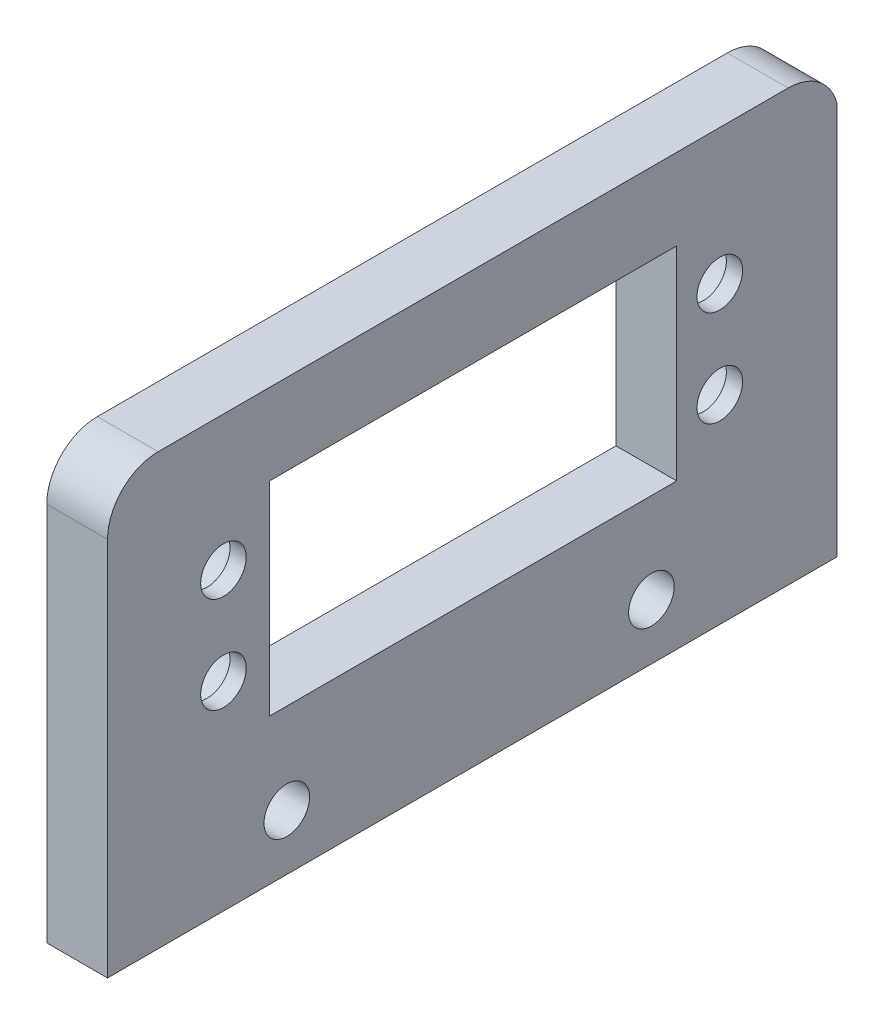
ISO-10303-21;
HEADER;
FILE_DESCRIPTION(('STEP AP214'),'2;1');
FILE_NAME('part.step','',(''),(''),'','','');
FILE_SCHEMA(('AUTOMOTIVE_DESIGN { 1 0 10303 214 1 1 1 1 }'));
ENDSEC;
DATA;
#1=APPLICATION_CONTEXT('core data for automotive mechanical design processes');
#2=APPLICATION_PROTOCOL_DEFINITION('international standard','automotive_design',2000,#1);
#3=PRODUCT_CONTEXT('',#1,'mechanical');
#4=PRODUCT('Part','Part','',(#3));
#5=PRODUCT_RELATED_PRODUCT_CATEGORY('part','',(#4));
#6=PRODUCT_DEFINITION_FORMATION('','',#4);
#7=PRODUCT_DEFINITION_CONTEXT('part definition',#1,'design');
#8=PRODUCT_DEFINITION('design','',#6,#7);
#9=PRODUCT_DEFINITION_SHAPE('','',#8);
#10=(LENGTH_UNIT() NAMED_UNIT(*) SI_UNIT(.MILLI.,.METRE.));
#11=(NAMED_UNIT(*) PLANE_ANGLE_UNIT() SI_UNIT($,.RADIAN.));
#12=(NAMED_UNIT(*) SI_UNIT($,.STERADIAN.) SOLID_ANGLE_UNIT());
#13=UNCERTAINTY_MEASURE_WITH_UNIT(LENGTH_MEASURE(1.E-05),#10,'distance_accuracy_value','');
#14=(GEOMETRIC_REPRESENTATION_CONTEXT(3) GLOBAL_UNCERTAINTY_ASSIGNED_CONTEXT((#13)) GLOBAL_UNIT_ASSIGNED_CONTEXT((#10,
#11,#12)) REPRESENTATION_CONTEXT('',''));
#15=CARTESIAN_POINT('',(0.,0.,0.));
#16=DIRECTION('',(0.,0.,1.));
#17=DIRECTION('',(1.,0.,0.));
#18=AXIS2_PLACEMENT_3D('',#15,#16,#17);
#19=CARTESIAN_POINT('',(6.,17.55,31.0961179679779));
#20=DIRECTION('',(-1.,0.,0.));
#21=DIRECTION('',(0.,0.,1.));
#22=AXIS2_PLACEMENT_3D('',#19,#20,#21);
#23=CYLINDRICAL_SURFACE('',#22,5.);
#24=CARTESIAN_POINT('',(0.,17.55,31.0961179679779));
#25=DIRECTION('',(-1.,0.,0.));
#26=DIRECTION('',(0.,0.,1.));
#27=AXIS2_PLACEMENT_3D('',#24,#25,#26);
#28=CIRCLE('',#27,5.);
#29=CARTESIAN_POINT('',(0.,17.55,36.0961179679779));
#30=VERTEX_POINT('',#29);
#31=CARTESIAN_POINT('',(0.,22.55,31.0961179679779));
#32=VERTEX_POINT('',#31);
#33=EDGE_CURVE('E154',#30,#32,#28,.T.);
#34=ORIENTED_EDGE('',*,*,#33,.F.);
#35=DIRECTION('',(-1.,0.,0.));
#36=VECTOR('',#35,1.);
#37=CARTESIAN_POINT('',(6.,17.55,36.0961179679779));
#38=LINE('',#37,#36);
#39=CARTESIAN_POINT('',(6.,17.55,36.0961179679779));
#40=VERTEX_POINT('',#39);
#41=EDGE_CURVE('E12',#40,#30,#38,.T.);
#42=ORIENTED_EDGE('',*,*,#41,.F.);
#43=CARTESIAN_POINT('',(6.,17.55,31.0961179679779));
#44=DIRECTION('',(-1.,0.,0.));
#45=DIRECTION('',(0.,0.,1.));
#46=AXIS2_PLACEMENT_3D('',#43,#44,#45);
#47=CIRCLE('',#46,5.);
#48=CARTESIAN_POINT('',(6.,22.55,31.0961179679779));
#49=VERTEX_POINT('',#48);
#50=EDGE_CURVE('E186',#40,#49,#47,.T.);
#51=ORIENTED_EDGE('',*,*,#50,.T.);
#52=DIRECTION('',(-1.,0.,0.));
#53=VECTOR('',#52,1.);
#54=CARTESIAN_POINT('',(6.,22.55,31.0961179679779));
#55=LINE('',#54,#53);
#56=EDGE_CURVE('E71',#49,#32,#55,.T.);
#57=ORIENTED_EDGE('',*,*,#56,.T.);
#58=EDGE_LOOP('',(#34,#42,#51,#57));
#59=FACE_BOUND('',#58,.T.);
#60=ADVANCED_FACE('F68',(#59),#23,.T.);
#61=CARTESIAN_POINT('',(6.,-19.95,36.0961179679779));
#62=DIRECTION('',(0.,0.,1.));
#63=DIRECTION('',(0.,-1.,0.));
#64=AXIS2_PLACEMENT_3D('',#61,#62,#63);
#65=PLANE('',#64);
#66=DIRECTION('',(0.,1.,0.));
#67=VECTOR('',#66,1.);
#68=CARTESIAN_POINT('',(0.,-19.95,36.0961179679779));
#69=LINE('',#68,#67);
#70=CARTESIAN_POINT('',(0.,-19.95,36.0961179679779));
#71=VERTEX_POINT('',#70);
#72=EDGE_CURVE('E190',#71,#30,#69,.T.);
#73=ORIENTED_EDGE('',*,*,#72,.F.);
#74=DIRECTION('',(-1.,0.,0.));
#75=VECTOR('',#74,1.);
#76=CARTESIAN_POINT('',(6.,-19.95,36.0961179679779));
#77=LINE('',#76,#75);
#78=CARTESIAN_POINT('',(6.,-19.95,36.0961179679779));
#79=VERTEX_POINT('',#78);
#80=EDGE_CURVE('E76',#79,#71,#77,.T.);
#81=ORIENTED_EDGE('',*,*,#80,.F.);
#82=DIRECTION('',(0.,1.,0.));
#83=VECTOR('',#82,1.);
#84=CARTESIAN_POINT('',(6.,-19.95,36.0961179679779));
#85=LINE('',#84,#83);
#86=EDGE_CURVE('E202',#79,#40,#85,.T.);
#87=ORIENTED_EDGE('',*,*,#86,.T.);
#88=ORIENTED_EDGE('',*,*,#41,.T.);
#89=EDGE_LOOP('',(#73,#81,#87,#88));
#90=FACE_BOUND('',#89,.T.);
#91=ADVANCED_FACE('F241',(#90),#65,.T.);
#92=CARTESIAN_POINT('',(6.,-19.95,-35.9468304687046));
#93=DIRECTION('',(0.,-1.,0.));
#94=DIRECTION('',(0.,0.,-1.));
#95=AXIS2_PLACEMENT_3D('',#92,#93,#94);
#96=PLANE('',#95);
#97=DIRECTION('',(0.,0.,1.));
#98=VECTOR('',#97,1.);
#99=CARTESIAN_POINT('',(0.,-19.95,-35.9468304687046));
#100=LINE('',#99,#98);
#101=CARTESIAN_POINT('',(0.,-19.95,-35.9468304687046));
#102=VERTEX_POINT('',#101);
#103=EDGE_CURVE('E216',#102,#71,#100,.T.);
#104=ORIENTED_EDGE('',*,*,#103,.F.);
#105=DIRECTION('',(-1.,0.,0.));
#106=VECTOR('',#105,1.);
#107=CARTESIAN_POINT('',(6.,-19.95,-35.9468304687046));
#108=LINE('',#107,#106);
#109=CARTESIAN_POINT('',(6.,-19.95,-35.9468304687046));
#110=VERTEX_POINT('',#109);
#111=EDGE_CURVE('E222',#110,#102,#108,.T.);
#112=ORIENTED_EDGE('',*,*,#111,.F.);
#113=DIRECTION('',(0.,0.,1.));
#114=VECTOR('',#113,1.);
#115=CARTESIAN_POINT('',(6.,-19.95,-35.9468304687046));
#116=LINE('',#115,#114);
#117=EDGE_CURVE('E199',#110,#79,#116,.T.);
#118=ORIENTED_EDGE('',*,*,#117,.T.);
#119=ORIENTED_EDGE('',*,*,#80,.T.);
#120=EDGE_LOOP('',(#104,#112,#118,#119));
#121=FACE_BOUND('',#120,.T.);
#122=ADVANCED_FACE('F252',(#121),#96,.T.);
#123=CARTESIAN_POINT('',(6.,18.7626781251816,-35.9468304687046));
#124=DIRECTION('',(0.,0.,-1.));
#125=DIRECTION('',(-1.,0.,0.));
#126=AXIS2_PLACEMENT_3D('',#123,#124,#125);
#127=PLANE('',#126);
#128=DIRECTION('',(0.,-1.,0.));
#129=VECTOR('',#128,1.);
#130=CARTESIAN_POINT('',(0.,18.7626781251816,-35.9468304687046));
#131=LINE('',#130,#129);
#132=CARTESIAN_POINT('',(0.,18.7626781251816,-35.9468304687046));
#133=VERTEX_POINT('',#132);
#134=EDGE_CURVE('E213',#133,#102,#131,.T.);
#135=ORIENTED_EDGE('',*,*,#134,.F.);
#136=DIRECTION('',(-1.,0.,0.));
#137=VECTOR('',#136,1.);
#138=CARTESIAN_POINT('',(6.,18.7626781251816,-35.9468304687046));
#139=LINE('',#138,#137);
#140=CARTESIAN_POINT('',(6.,18.7626781251816,-35.9468304687046));
#141=VERTEX_POINT('',#140);
#142=EDGE_CURVE('E224',#141,#133,#139,.T.);
#143=ORIENTED_EDGE('',*,*,#142,.F.);
#144=DIRECTION('',(0.,-1.,0.));
#145=VECTOR('',#144,1.);
#146=CARTESIAN_POINT('',(6.,18.7626781251816,-35.9468304687046));
#147=LINE('',#146,#145);
#148=EDGE_CURVE('E196',#141,#110,#147,.T.);
#149=ORIENTED_EDGE('',*,*,#148,.T.);
#150=ORIENTED_EDGE('',*,*,#111,.T.);
#151=EDGE_LOOP('',(#135,#143,#149,#150));
#152=FACE_BOUND('',#151,.T.);
#153=ADVANCED_FACE('F250',(#152),#127,.T.);
#154=CARTESIAN_POINT('',(6.,17.55,-31.0961179679779));
#155=DIRECTION('',(-1.,0.,0.));
#156=DIRECTION('',(0.,0.,1.));
#157=AXIS2_PLACEMENT_3D('',#154,#155,#156);
#158=CYLINDRICAL_SURFACE('',#157,5.);
#159=CARTESIAN_POINT('',(0.,17.55,-31.0961179679779));
#160=DIRECTION('',(-1.,0.,0.));
#161=DIRECTION('',(0.,0.,1.));
#162=AXIS2_PLACEMENT_3D('',#159,#160,#161);
#163=CIRCLE('',#162,5.);
#164=CARTESIAN_POINT('',(0.,22.55,-31.0961179679779));
#165=VERTEX_POINT('',#164);
#166=EDGE_CURVE('E210',#165,#133,#163,.T.);
#167=ORIENTED_EDGE('',*,*,#166,.F.);
#168=DIRECTION('',(-1.,0.,0.));
#169=VECTOR('',#168,1.);
#170=CARTESIAN_POINT('',(6.,22.55,-31.0961179679779));
#171=LINE('',#170,#169);
#172=CARTESIAN_POINT('',(6.,22.55,-31.0961179679779));
#173=VERTEX_POINT('',#172);
#174=EDGE_CURVE('E225',#173,#165,#171,.T.);
#175=ORIENTED_EDGE('',*,*,#174,.F.);
#176=CARTESIAN_POINT('',(6.,17.55,-31.0961179679779));
#177=DIRECTION('',(-1.,0.,0.));
#178=DIRECTION('',(0.,0.,1.));
#179=AXIS2_PLACEMENT_3D('',#176,#177,#178);
#180=CIRCLE('',#179,5.);
#181=EDGE_CURVE('E193',#173,#141,#180,.T.);
#182=ORIENTED_EDGE('',*,*,#181,.T.);
#183=ORIENTED_EDGE('',*,*,#142,.T.);
#184=EDGE_LOOP('',(#167,#175,#182,#183));
#185=FACE_BOUND('',#184,.T.);
#186=ADVANCED_FACE('F247',(#185),#158,.T.);
#187=CARTESIAN_POINT('',(6.,22.55,31.0961179679779));
#188=DIRECTION('',(0.,1.,0.));
#189=DIRECTION('',(0.,0.,1.));
#190=AXIS2_PLACEMENT_3D('',#187,#188,#189);
#191=PLANE('',#190);
#192=DIRECTION('',(0.,0.,-1.));
#193=VECTOR('',#192,1.);
#194=CARTESIAN_POINT('',(0.,22.55,31.0961179679779));
#195=LINE('',#194,#193);
#196=EDGE_CURVE('E207',#32,#165,#195,.T.);
#197=ORIENTED_EDGE('',*,*,#196,.F.);
#198=ORIENTED_EDGE('',*,*,#56,.F.);
#199=DIRECTION('',(0.,0.,-1.));
#200=VECTOR('',#199,1.);
#201=CARTESIAN_POINT('',(6.,22.55,31.0961179679779));
#202=LINE('',#201,#200);
#203=EDGE_CURVE('E189',#49,#173,#202,.T.);
#204=ORIENTED_EDGE('',*,*,#203,.T.);
#205=ORIENTED_EDGE('',*,*,#174,.T.);
#206=EDGE_LOOP('',(#197,#198,#204,#205));
#207=FACE_BOUND('',#206,.T.);
#208=ADVANCED_FACE('F235',(#207),#191,.T.);
#209=CARTESIAN_POINT('',(6.,17.55,31.0961179679779));
#210=DIRECTION('',(-1.,0.,0.));
#211=DIRECTION('',(0.,0.,1.));
#212=AXIS2_PLACEMENT_3D('',#209,#210,#211);
#213=PLANE('',#212);
#214=CARTESIAN_POINT('',(6.00000000000001,-14.45,-17.6000000000001));
#215=DIRECTION('',(-1.,0.,0.));
#216=DIRECTION('',(0.,0.,1.));
#217=AXIS2_PLACEMENT_3D('',#214,#215,#216);
#218=CIRCLE('',#217,2.24999999999999);
#219=CARTESIAN_POINT('',(6.00000000000001,-14.45,-15.3500000000001));
#220=VERTEX_POINT('',#219);
#221=EDGE_CURVE('E493',#220,#220,#218,.T.);
#222=ORIENTED_EDGE('',*,*,#221,.T.);
#223=EDGE_LOOP('',(#222));
#224=FACE_BOUND('',#223,.T.);
#225=CARTESIAN_POINT('',(6.00000000000001,-14.45,18.3999999999999));
#226=DIRECTION('',(-1.,0.,0.));
#227=DIRECTION('',(0.,0.,1.));
#228=AXIS2_PLACEMENT_3D('',#225,#226,#227);
#229=CIRCLE('',#228,2.24999999999999);
#230=CARTESIAN_POINT('',(6.00000000000001,-14.45,20.6499999999999));
#231=VERTEX_POINT('',#230);
#232=EDGE_CURVE('E503',#231,#231,#229,.T.);
#233=ORIENTED_EDGE('',*,*,#232,.T.);
#234=EDGE_LOOP('',(#233));
#235=FACE_BOUND('',#234,.T.);
#236=CARTESIAN_POINT('',(6.00000000000001,-0.299999999999995,24.65));
#237=DIRECTION('',(-1.,0.,0.));
#238=DIRECTION('',(0.,0.,1.));
#239=AXIS2_PLACEMENT_3D('',#236,#237,#238);
#240=CIRCLE('',#239,2.25000000000001);
#241=CARTESIAN_POINT('',(6.00000000000001,-0.299999999999995,26.9));
#242=VERTEX_POINT('',#241);
#243=EDGE_CURVE('E515',#242,#242,#240,.T.);
#244=ORIENTED_EDGE('',*,*,#243,.T.);
#245=EDGE_LOOP('',(#244));
#246=FACE_BOUND('',#245,.T.);
#247=CARTESIAN_POINT('',(6.00000000000001,9.20000000000001,24.65));
#248=DIRECTION('',(-1.,0.,0.));
#249=DIRECTION('',(0.,0.,1.));
#250=AXIS2_PLACEMENT_3D('',#247,#248,#249);
#251=CIRCLE('',#250,2.25000000000001);
#252=CARTESIAN_POINT('',(6.00000000000001,9.20000000000001,26.9));
#253=VERTEX_POINT('',#252);
#254=EDGE_CURVE('E527',#253,#253,#251,.T.);
#255=ORIENTED_EDGE('',*,*,#254,.T.);
#256=EDGE_LOOP('',(#255));
#257=FACE_BOUND('',#256,.T.);
#258=CARTESIAN_POINT('',(6.00000000000001,-0.299999999999995,-24.3500000000001));
#259=DIRECTION('',(-1.,0.,0.));
#260=DIRECTION('',(0.,0.,1.));
#261=AXIS2_PLACEMENT_3D('',#258,#259,#260);
#262=CIRCLE('',#261,2.25000000000001);
#263=CARTESIAN_POINT('',(6.00000000000001,-0.299999999999995,-22.1000000000001));
#264=VERTEX_POINT('',#263);
#265=EDGE_CURVE('E539',#264,#264,#262,.T.);
#266=ORIENTED_EDGE('',*,*,#265,.T.);
#267=EDGE_LOOP('',(#266));
#268=FACE_BOUND('',#267,.T.);
#269=CARTESIAN_POINT('',(6.00000000000001,9.20000000000001,-24.3500000000001));
#270=DIRECTION('',(-1.,0.,0.));
#271=DIRECTION('',(0.,0.,1.));
#272=AXIS2_PLACEMENT_3D('',#269,#270,#271);
#273=CIRCLE('',#272,2.25000000000001);
#274=CARTESIAN_POINT('',(6.00000000000001,9.20000000000001,-22.1000000000001));
#275=VERTEX_POINT('',#274);
#276=EDGE_CURVE('E176',#275,#275,#273,.T.);
#277=ORIENTED_EDGE('',*,*,#276,.T.);
#278=EDGE_LOOP('',(#277));
#279=FACE_BOUND('',#278,.T.);
#280=DIRECTION('',(0.,0.,1.));
#281=VECTOR('',#280,1.);
#282=CARTESIAN_POINT('',(6.,-5.55,0.));
#283=LINE('',#282,#281);
#284=CARTESIAN_POINT('',(6.,-5.55,-20.1));
#285=VERTEX_POINT('',#284);
#286=CARTESIAN_POINT('',(6.,-5.55,20.1));
#287=VERTEX_POINT('',#286);
#288=EDGE_CURVE('E150',#285,#287,#283,.T.);
#289=ORIENTED_EDGE('',*,*,#288,.T.);
#290=DIRECTION('',(0.,1.,0.));
#291=VECTOR('',#290,1.);
#292=CARTESIAN_POINT('',(6.,0.,20.1));
#293=LINE('',#292,#291);
#294=CARTESIAN_POINT('',(6.,14.55,20.1));
#295=VERTEX_POINT('',#294);
#296=EDGE_CURVE('E158',#287,#295,#293,.T.);
#297=ORIENTED_EDGE('',*,*,#296,.T.);
#298=DIRECTION('',(0.,0.,1.));
#299=VECTOR('',#298,1.);
#300=CARTESIAN_POINT('',(6.,14.55,0.));
#301=LINE('',#300,#299);
#302=CARTESIAN_POINT('',(6.,14.55,-20.1));
#303=VERTEX_POINT('',#302);
#304=EDGE_CURVE('E169',#303,#295,#301,.T.);
#305=ORIENTED_EDGE('',*,*,#304,.F.);
#306=DIRECTION('',(0.,1.,0.));
#307=VECTOR('',#306,1.);
#308=CARTESIAN_POINT('',(6.,0.,-20.1));
#309=LINE('',#308,#307);
#310=EDGE_CURVE('E167',#285,#303,#309,.T.);
#311=ORIENTED_EDGE('',*,*,#310,.F.);
#312=EDGE_LOOP('',(#289,#297,#305,#311));
#313=FACE_BOUND('',#312,.T.);
#314=ORIENTED_EDGE('',*,*,#50,.F.);
#315=ORIENTED_EDGE('',*,*,#86,.F.);
#316=ORIENTED_EDGE('',*,*,#117,.F.);
#317=ORIENTED_EDGE('',*,*,#148,.F.);
#318=ORIENTED_EDGE('',*,*,#181,.F.);
#319=ORIENTED_EDGE('',*,*,#203,.F.);
#320=EDGE_LOOP('',(#314,#315,#316,#317,#318,#319));
#321=FACE_BOUND('',#320,.T.);
#322=ADVANCED_FACE('F165',(#224,#235,#246,#257,#268,#279,#313,#321),#213,.F.);
#323=CARTESIAN_POINT('',(0.,17.55,31.0961179679779));
#324=DIRECTION('',(-1.,0.,0.));
#325=DIRECTION('',(0.,0.,1.));
#326=AXIS2_PLACEMENT_3D('',#323,#324,#325);
#327=PLANE('',#326);
#328=CARTESIAN_POINT('',(0.,-14.45,-17.6000000000001));
#329=DIRECTION('',(-1.,0.,0.));
#330=DIRECTION('',(0.,0.,1.));
#331=AXIS2_PLACEMENT_3D('',#328,#329,#330);
#332=CIRCLE('',#331,2.24999999999999);
#333=CARTESIAN_POINT('',(0.,-14.45,-15.3500000000001));
#334=VERTEX_POINT('',#333);
#335=EDGE_CURVE('E496',#334,#334,#332,.T.);
#336=ORIENTED_EDGE('',*,*,#335,.F.);
#337=EDGE_LOOP('',(#336));
#338=FACE_BOUND('',#337,.T.);
#339=CARTESIAN_POINT('',(0.,-14.45,18.3999999999999));
#340=DIRECTION('',(-1.,0.,0.));
#341=DIRECTION('',(0.,0.,1.));
#342=AXIS2_PLACEMENT_3D('',#339,#340,#341);
#343=CIRCLE('',#342,2.24999999999999);
#344=CARTESIAN_POINT('',(0.,-14.45,20.6499999999999));
#345=VERTEX_POINT('',#344);
#346=EDGE_CURVE('E498',#345,#345,#343,.T.);
#347=ORIENTED_EDGE('',*,*,#346,.F.);
#348=EDGE_LOOP('',(#347));
#349=FACE_BOUND('',#348,.T.);
#350=CARTESIAN_POINT('',(0.,-0.299999999999995,24.65));
#351=DIRECTION('',(-1.,0.,0.));
#352=DIRECTION('',(0.,0.,1.));
#353=AXIS2_PLACEMENT_3D('',#350,#351,#352);
#354=CIRCLE('',#353,3.99999999999999);
#355=CARTESIAN_POINT('',(0.,-0.299999999999995,28.65));
#356=VERTEX_POINT('',#355);
#357=EDGE_CURVE('E506',#356,#356,#354,.T.);
#358=ORIENTED_EDGE('',*,*,#357,.F.);
#359=EDGE_LOOP('',(#358));
#360=FACE_BOUND('',#359,.T.);
#361=CARTESIAN_POINT('',(0.,9.20000000000001,24.65));
#362=DIRECTION('',(-1.,0.,0.));
#363=DIRECTION('',(0.,0.,1.));
#364=AXIS2_PLACEMENT_3D('',#361,#362,#363);
#365=CIRCLE('',#364,3.99999999999999);
#366=CARTESIAN_POINT('',(0.,9.20000000000001,28.65));
#367=VERTEX_POINT('',#366);
#368=EDGE_CURVE('E518',#367,#367,#365,.T.);
#369=ORIENTED_EDGE('',*,*,#368,.F.);
#370=EDGE_LOOP('',(#369));
#371=FACE_BOUND('',#370,.T.);
#372=CARTESIAN_POINT('',(0.,-0.299999999999995,-24.3500000000001));
#373=DIRECTION('',(-1.,0.,0.));
#374=DIRECTION('',(0.,0.,1.));
#375=AXIS2_PLACEMENT_3D('',#372,#373,#374);
#376=CIRCLE('',#375,3.99999999999999);
#377=CARTESIAN_POINT('',(0.,-0.299999999999995,-20.3500000000001));
#378=VERTEX_POINT('',#377);
#379=EDGE_CURVE('E530',#378,#378,#376,.T.);
#380=ORIENTED_EDGE('',*,*,#379,.F.);
#381=EDGE_LOOP('',(#380));
#382=FACE_BOUND('',#381,.T.);
#383=CARTESIAN_POINT('',(0.,9.20000000000001,-24.3500000000001));
#384=DIRECTION('',(-1.,0.,0.));
#385=DIRECTION('',(0.,0.,1.));
#386=AXIS2_PLACEMENT_3D('',#383,#384,#385);
#387=CIRCLE('',#386,3.99999999999999);
#388=CARTESIAN_POINT('',(0.,9.20000000000001,-20.3500000000001));
#389=VERTEX_POINT('',#388);
#390=EDGE_CURVE('E542',#389,#389,#387,.T.);
#391=ORIENTED_EDGE('',*,*,#390,.F.);
#392=EDGE_LOOP('',(#391));
#393=FACE_BOUND('',#392,.T.);
#394=DIRECTION('',(0.,1.,0.));
#395=VECTOR('',#394,1.);
#396=CARTESIAN_POINT('',(0.,0.,20.1));
#397=LINE('',#396,#395);
#398=CARTESIAN_POINT('',(0.,-5.55,20.1));
#399=VERTEX_POINT('',#398);
#400=CARTESIAN_POINT('',(0.,14.55,20.1));
#401=VERTEX_POINT('',#400);
#402=EDGE_CURVE('E92',#399,#401,#397,.T.);
#403=ORIENTED_EDGE('',*,*,#402,.F.);
#404=DIRECTION('',(0.,0.,1.));
#405=VECTOR('',#404,1.);
#406=CARTESIAN_POINT('',(0.,-5.55,0.));
#407=LINE('',#406,#405);
#408=CARTESIAN_POINT('',(0.,-5.55,-20.1));
#409=VERTEX_POINT('',#408);
#410=EDGE_CURVE('E153',#409,#399,#407,.T.);
#411=ORIENTED_EDGE('',*,*,#410,.F.);
#412=DIRECTION('',(0.,1.,0.));
#413=VECTOR('',#412,1.);
#414=CARTESIAN_POINT('',(0.,0.,-20.1));
#415=LINE('',#414,#413);
#416=CARTESIAN_POINT('',(0.,14.55,-20.1));
#417=VERTEX_POINT('',#416);
#418=EDGE_CURVE('E178',#409,#417,#415,.T.);
#419=ORIENTED_EDGE('',*,*,#418,.T.);
#420=DIRECTION('',(0.,0.,1.));
#421=VECTOR('',#420,1.);
#422=CARTESIAN_POINT('',(0.,14.55,0.));
#423=LINE('',#422,#421);
#424=EDGE_CURVE('E163',#417,#401,#423,.T.);
#425=ORIENTED_EDGE('',*,*,#424,.T.);
#426=EDGE_LOOP('',(#403,#411,#419,#425));
#427=FACE_BOUND('',#426,.T.);
#428=ORIENTED_EDGE('',*,*,#33,.T.);
#429=ORIENTED_EDGE('',*,*,#196,.T.);
#430=ORIENTED_EDGE('',*,*,#166,.T.);
#431=ORIENTED_EDGE('',*,*,#134,.T.);
#432=ORIENTED_EDGE('',*,*,#103,.T.);
#433=ORIENTED_EDGE('',*,*,#72,.T.);
#434=EDGE_LOOP('',(#428,#429,#430,#431,#432,#433));
#435=FACE_BOUND('',#434,.T.);
#436=ADVANCED_FACE('F237',(#338,#349,#360,#371,#382,#393,#427,#435),#327,.T.);
#437=CARTESIAN_POINT('',(6.,0.,20.1));
#438=DIRECTION('',(0.,0.,1.));
#439=DIRECTION('',(1.,0.,0.));
#440=AXIS2_PLACEMENT_3D('',#437,#438,#439);
#441=PLANE('',#440);
#442=ORIENTED_EDGE('',*,*,#402,.T.);
#443=DIRECTION('',(-1.,0.,0.));
#444=VECTOR('',#443,1.);
#445=CARTESIAN_POINT('',(6.,14.55,20.1));
#446=LINE('',#445,#444);
#447=EDGE_CURVE('E160',#295,#401,#446,.T.);
#448=ORIENTED_EDGE('',*,*,#447,.F.);
#449=ORIENTED_EDGE('',*,*,#296,.F.);
#450=DIRECTION('',(-1.,0.,0.));
#451=VECTOR('',#450,1.);
#452=CARTESIAN_POINT('',(6.,-5.55,20.1));
#453=LINE('',#452,#451);
#454=EDGE_CURVE('E146',#287,#399,#453,.T.);
#455=ORIENTED_EDGE('',*,*,#454,.T.);
#456=EDGE_LOOP('',(#442,#448,#449,#455));
#457=FACE_BOUND('',#456,.T.);
#458=ADVANCED_FACE('F159',(#457),#441,.F.);
#459=CARTESIAN_POINT('',(6.,-5.55,0.));
#460=DIRECTION('',(0.,-1.,0.));
#461=DIRECTION('',(0.,0.,-1.));
#462=AXIS2_PLACEMENT_3D('',#459,#460,#461);
#463=PLANE('',#462);
#464=ORIENTED_EDGE('',*,*,#410,.T.);
#465=ORIENTED_EDGE('',*,*,#454,.F.);
#466=ORIENTED_EDGE('',*,*,#288,.F.);
#467=DIRECTION('',(-1.,0.,0.));
#468=VECTOR('',#467,1.);
#469=CARTESIAN_POINT('',(6.,-5.55,-20.1));
#470=LINE('',#469,#468);
#471=EDGE_CURVE('E155',#285,#409,#470,.T.);
#472=ORIENTED_EDGE('',*,*,#471,.T.);
#473=EDGE_LOOP('',(#464,#465,#466,#472));
#474=FACE_BOUND('',#473,.T.);
#475=ADVANCED_FACE('F148',(#474),#463,.F.);
#476=CARTESIAN_POINT('',(6.,0.,-20.1));
#477=DIRECTION('',(0.,0.,1.));
#478=DIRECTION('',(0.,-1.,0.));
#479=AXIS2_PLACEMENT_3D('',#476,#477,#478);
#480=PLANE('',#479);
#481=ORIENTED_EDGE('',*,*,#418,.F.);
#482=ORIENTED_EDGE('',*,*,#471,.F.);
#483=ORIENTED_EDGE('',*,*,#310,.T.);
#484=DIRECTION('',(-1.,0.,0.));
#485=VECTOR('',#484,1.);
#486=CARTESIAN_POINT('',(6.,14.55,-20.1));
#487=LINE('',#486,#485);
#488=EDGE_CURVE('E84',#303,#417,#487,.T.);
#489=ORIENTED_EDGE('',*,*,#488,.T.);
#490=EDGE_LOOP('',(#481,#482,#483,#489));
#491=FACE_BOUND('',#490,.T.);
#492=ADVANCED_FACE('F314',(#491),#480,.T.);
#493=CARTESIAN_POINT('',(6.,14.55,0.));
#494=DIRECTION('',(0.,-1.,0.));
#495=DIRECTION('',(0.,0.,-1.));
#496=AXIS2_PLACEMENT_3D('',#493,#494,#495);
#497=PLANE('',#496);
#498=ORIENTED_EDGE('',*,*,#424,.F.);
#499=ORIENTED_EDGE('',*,*,#488,.F.);
#500=ORIENTED_EDGE('',*,*,#304,.T.);
#501=ORIENTED_EDGE('',*,*,#447,.T.);
#502=EDGE_LOOP('',(#498,#499,#500,#501));
#503=FACE_BOUND('',#502,.T.);
#504=ADVANCED_FACE('F323',(#503),#497,.T.);
#505=CARTESIAN_POINT('',(0.,9.20000000000001,-24.3500000000001));
#506=DIRECTION('',(-1.,0.,0.));
#507=DIRECTION('',(0.,0.,1.));
#508=AXIS2_PLACEMENT_3D('',#505,#506,#507);
#509=CYLINDRICAL_SURFACE('',#508,2.25000000000001);
#510=ORIENTED_EDGE('',*,*,#276,.F.);
#511=EDGE_LOOP('',(#510));
#512=FACE_BOUND('',#511,.T.);
#513=CARTESIAN_POINT('',(4.4,9.20000000000001,-24.3500000000001));
#514=DIRECTION('',(-1.,0.,0.));
#515=DIRECTION('',(0.,0.,1.));
#516=AXIS2_PLACEMENT_3D('',#513,#514,#515);
#517=CIRCLE('',#516,2.25000000000001);
#518=CARTESIAN_POINT('',(4.4,9.20000000000001,-22.1000000000001));
#519=VERTEX_POINT('',#518);
#520=EDGE_CURVE('E548',#519,#519,#517,.T.);
#521=ORIENTED_EDGE('',*,*,#520,.T.);
#522=EDGE_LOOP('',(#521));
#523=FACE_BOUND('',#522,.T.);
#524=ADVANCED_FACE('F333',(#512,#523),#509,.F.);
#525=CARTESIAN_POINT('',(4.4,11.45,-24.3500000000001));
#526=DIRECTION('',(1.,0.,0.));
#527=DIRECTION('',(0.,0.,-1.));
#528=AXIS2_PLACEMENT_3D('',#525,#526,#527);
#529=PLANE('',#528);
#530=ORIENTED_EDGE('',*,*,#520,.F.);
#531=EDGE_LOOP('',(#530));
#532=FACE_BOUND('',#531,.T.);
#533=CARTESIAN_POINT('',(4.4,9.20000000000001,-24.3500000000001));
#534=DIRECTION('',(-1.,0.,0.));
#535=DIRECTION('',(0.,0.,1.));
#536=AXIS2_PLACEMENT_3D('',#533,#534,#535);
#537=CIRCLE('',#536,4.);
#538=CARTESIAN_POINT('',(4.4,9.20000000000001,-20.3500000000001));
#539=VERTEX_POINT('',#538);
#540=EDGE_CURVE('E545',#539,#539,#537,.T.);
#541=ORIENTED_EDGE('',*,*,#540,.T.);
#542=EDGE_LOOP('',(#541));
#543=FACE_BOUND('',#542,.T.);
#544=ADVANCED_FACE('F342',(#532,#543),#529,.F.);
#545=CARTESIAN_POINT('',(0.,9.20000000000001,-24.3500000000001));
#546=DIRECTION('',(-1.,0.,0.));
#547=DIRECTION('',(0.,0.,1.));
#548=AXIS2_PLACEMENT_3D('',#545,#546,#547);
#549=CYLINDRICAL_SURFACE('',#548,3.99999999999999);
#550=ORIENTED_EDGE('',*,*,#540,.F.);
#551=EDGE_LOOP('',(#550));
#552=FACE_BOUND('',#551,.T.);
#553=ORIENTED_EDGE('',*,*,#390,.T.);
#554=EDGE_LOOP('',(#553));
#555=FACE_BOUND('',#554,.T.);
#556=ADVANCED_FACE('F352',(#552,#555),#549,.F.);
#557=CARTESIAN_POINT('',(0.,-0.299999999999995,-24.3500000000001));
#558=DIRECTION('',(-1.,0.,0.));
#559=DIRECTION('',(0.,0.,1.));
#560=AXIS2_PLACEMENT_3D('',#557,#558,#559);
#561=CYLINDRICAL_SURFACE('',#560,2.25000000000001);
#562=ORIENTED_EDGE('',*,*,#265,.F.);
#563=EDGE_LOOP('',(#562));
#564=FACE_BOUND('',#563,.T.);
#565=CARTESIAN_POINT('',(4.4,-0.299999999999995,-24.3500000000001));
#566=DIRECTION('',(-1.,0.,0.));
#567=DIRECTION('',(0.,0.,1.));
#568=AXIS2_PLACEMENT_3D('',#565,#566,#567);
#569=CIRCLE('',#568,2.25000000000001);
#570=CARTESIAN_POINT('',(4.4,-0.299999999999995,-22.1000000000001));
#571=VERTEX_POINT('',#570);
#572=EDGE_CURVE('E536',#571,#571,#569,.T.);
#573=ORIENTED_EDGE('',*,*,#572,.T.);
#574=EDGE_LOOP('',(#573));
#575=FACE_BOUND('',#574,.T.);
#576=ADVANCED_FACE('F362',(#564,#575),#561,.F.);
#577=CARTESIAN_POINT('',(4.4,1.95000000000002,-24.3500000000001));
#578=DIRECTION('',(1.,0.,0.));
#579=DIRECTION('',(0.,0.,-1.));
#580=AXIS2_PLACEMENT_3D('',#577,#578,#579);
#581=PLANE('',#580);
#582=ORIENTED_EDGE('',*,*,#572,.F.);
#583=EDGE_LOOP('',(#582));
#584=FACE_BOUND('',#583,.T.);
#585=CARTESIAN_POINT('',(4.4,-0.299999999999995,-24.3500000000001));
#586=DIRECTION('',(-1.,0.,0.));
#587=DIRECTION('',(0.,0.,1.));
#588=AXIS2_PLACEMENT_3D('',#585,#586,#587);
#589=CIRCLE('',#588,4.);
#590=CARTESIAN_POINT('',(4.4,-0.299999999999995,-20.3500000000001));
#591=VERTEX_POINT('',#590);
#592=EDGE_CURVE('E533',#591,#591,#589,.T.);
#593=ORIENTED_EDGE('',*,*,#592,.T.);
#594=EDGE_LOOP('',(#593));
#595=FACE_BOUND('',#594,.T.);
#596=ADVANCED_FACE('F372',(#584,#595),#581,.F.);
#597=CARTESIAN_POINT('',(0.,-0.299999999999995,-24.3500000000001));
#598=DIRECTION('',(-1.,0.,0.));
#599=DIRECTION('',(0.,0.,1.));
#600=AXIS2_PLACEMENT_3D('',#597,#598,#599);
#601=CYLINDRICAL_SURFACE('',#600,3.99999999999999);
#602=ORIENTED_EDGE('',*,*,#592,.F.);
#603=EDGE_LOOP('',(#602));
#604=FACE_BOUND('',#603,.T.);
#605=ORIENTED_EDGE('',*,*,#379,.T.);
#606=EDGE_LOOP('',(#605));
#607=FACE_BOUND('',#606,.T.);
#608=ADVANCED_FACE('F382',(#604,#607),#601,.F.);
#609=CARTESIAN_POINT('',(0.,9.20000000000001,24.65));
#610=DIRECTION('',(-1.,0.,0.));
#611=DIRECTION('',(0.,0.,1.));
#612=AXIS2_PLACEMENT_3D('',#609,#610,#611);
#613=CYLINDRICAL_SURFACE('',#612,2.25000000000001);
#614=ORIENTED_EDGE('',*,*,#254,.F.);
#615=EDGE_LOOP('',(#614));
#616=FACE_BOUND('',#615,.T.);
#617=CARTESIAN_POINT('',(4.4,9.20000000000001,24.65));
#618=DIRECTION('',(-1.,0.,0.));
#619=DIRECTION('',(0.,0.,1.));
#620=AXIS2_PLACEMENT_3D('',#617,#618,#619);
#621=CIRCLE('',#620,2.25000000000001);
#622=CARTESIAN_POINT('',(4.4,9.20000000000001,26.9));
#623=VERTEX_POINT('',#622);
#624=EDGE_CURVE('E524',#623,#623,#621,.T.);
#625=ORIENTED_EDGE('',*,*,#624,.T.);
#626=EDGE_LOOP('',(#625));
#627=FACE_BOUND('',#626,.T.);
#628=ADVANCED_FACE('F392',(#616,#627),#613,.F.);
#629=CARTESIAN_POINT('',(4.4,11.45,24.65));
#630=DIRECTION('',(1.,0.,0.));
#631=DIRECTION('',(0.,0.,-1.));
#632=AXIS2_PLACEMENT_3D('',#629,#630,#631);
#633=PLANE('',#632);
#634=ORIENTED_EDGE('',*,*,#624,.F.);
#635=EDGE_LOOP('',(#634));
#636=FACE_BOUND('',#635,.T.);
#637=CARTESIAN_POINT('',(4.4,9.20000000000001,24.65));
#638=DIRECTION('',(-1.,0.,0.));
#639=DIRECTION('',(0.,0.,1.));
#640=AXIS2_PLACEMENT_3D('',#637,#638,#639);
#641=CIRCLE('',#640,4.);
#642=CARTESIAN_POINT('',(4.4,9.20000000000001,28.65));
#643=VERTEX_POINT('',#642);
#644=EDGE_CURVE('E521',#643,#643,#641,.T.);
#645=ORIENTED_EDGE('',*,*,#644,.T.);
#646=EDGE_LOOP('',(#645));
#647=FACE_BOUND('',#646,.T.);
#648=ADVANCED_FACE('F402',(#636,#647),#633,.F.);
#649=CARTESIAN_POINT('',(0.,9.20000000000001,24.65));
#650=DIRECTION('',(-1.,0.,0.));
#651=DIRECTION('',(0.,0.,1.));
#652=AXIS2_PLACEMENT_3D('',#649,#650,#651);
#653=CYLINDRICAL_SURFACE('',#652,3.99999999999999);
#654=ORIENTED_EDGE('',*,*,#644,.F.);
#655=EDGE_LOOP('',(#654));
#656=FACE_BOUND('',#655,.T.);
#657=ORIENTED_EDGE('',*,*,#368,.T.);
#658=EDGE_LOOP('',(#657));
#659=FACE_BOUND('',#658,.T.);
#660=ADVANCED_FACE('F412',(#656,#659),#653,.F.);
#661=CARTESIAN_POINT('',(0.,-0.299999999999995,24.65));
#662=DIRECTION('',(-1.,0.,0.));
#663=DIRECTION('',(0.,0.,1.));
#664=AXIS2_PLACEMENT_3D('',#661,#662,#663);
#665=CYLINDRICAL_SURFACE('',#664,2.25000000000001);
#666=ORIENTED_EDGE('',*,*,#243,.F.);
#667=EDGE_LOOP('',(#666));
#668=FACE_BOUND('',#667,.T.);
#669=CARTESIAN_POINT('',(4.4,-0.299999999999995,24.65));
#670=DIRECTION('',(-1.,0.,0.));
#671=DIRECTION('',(0.,0.,1.));
#672=AXIS2_PLACEMENT_3D('',#669,#670,#671);
#673=CIRCLE('',#672,2.25000000000001);
#674=CARTESIAN_POINT('',(4.4,-0.299999999999995,26.9));
#675=VERTEX_POINT('',#674);
#676=EDGE_CURVE('E512',#675,#675,#673,.T.);
#677=ORIENTED_EDGE('',*,*,#676,.T.);
#678=EDGE_LOOP('',(#677));
#679=FACE_BOUND('',#678,.T.);
#680=ADVANCED_FACE('F422',(#668,#679),#665,.F.);
#681=CARTESIAN_POINT('',(4.4,1.95000000000002,24.65));
#682=DIRECTION('',(1.,0.,0.));
#683=DIRECTION('',(0.,0.,-1.));
#684=AXIS2_PLACEMENT_3D('',#681,#682,#683);
#685=PLANE('',#684);
#686=ORIENTED_EDGE('',*,*,#676,.F.);
#687=EDGE_LOOP('',(#686));
#688=FACE_BOUND('',#687,.T.);
#689=CARTESIAN_POINT('',(4.4,-0.299999999999995,24.65));
#690=DIRECTION('',(-1.,0.,0.));
#691=DIRECTION('',(0.,0.,1.));
#692=AXIS2_PLACEMENT_3D('',#689,#690,#691);
#693=CIRCLE('',#692,4.);
#694=CARTESIAN_POINT('',(4.4,-0.299999999999995,28.65));
#695=VERTEX_POINT('',#694);
#696=EDGE_CURVE('E509',#695,#695,#693,.T.);
#697=ORIENTED_EDGE('',*,*,#696,.T.);
#698=EDGE_LOOP('',(#697));
#699=FACE_BOUND('',#698,.T.);
#700=ADVANCED_FACE('F432',(#688,#699),#685,.F.);
#701=CARTESIAN_POINT('',(0.,-0.299999999999995,24.65));
#702=DIRECTION('',(-1.,0.,0.));
#703=DIRECTION('',(0.,0.,1.));
#704=AXIS2_PLACEMENT_3D('',#701,#702,#703);
#705=CYLINDRICAL_SURFACE('',#704,3.99999999999999);
#706=ORIENTED_EDGE('',*,*,#696,.F.);
#707=EDGE_LOOP('',(#706));
#708=FACE_BOUND('',#707,.T.);
#709=ORIENTED_EDGE('',*,*,#357,.T.);
#710=EDGE_LOOP('',(#709));
#711=FACE_BOUND('',#710,.T.);
#712=ADVANCED_FACE('F442',(#708,#711),#705,.F.);
#713=CARTESIAN_POINT('',(0.,-14.45,18.3999999999999));
#714=DIRECTION('',(-1.,0.,0.));
#715=DIRECTION('',(0.,0.,1.));
#716=AXIS2_PLACEMENT_3D('',#713,#714,#715);
#717=CYLINDRICAL_SURFACE('',#716,2.24999999999999);
#718=ORIENTED_EDGE('',*,*,#232,.F.);
#719=EDGE_LOOP('',(#718));
#720=FACE_BOUND('',#719,.T.);
#721=ORIENTED_EDGE('',*,*,#346,.T.);
#722=EDGE_LOOP('',(#721));
#723=FACE_BOUND('',#722,.T.);
#724=ADVANCED_FACE('F452',(#720,#723),#717,.F.);
#725=CARTESIAN_POINT('',(0.,-14.45,-17.6000000000001));
#726=DIRECTION('',(-1.,0.,0.));
#727=DIRECTION('',(0.,0.,1.));
#728=AXIS2_PLACEMENT_3D('',#725,#726,#727);
#729=CYLINDRICAL_SURFACE('',#728,2.24999999999999);
#730=ORIENTED_EDGE('',*,*,#221,.F.);
#731=EDGE_LOOP('',(#730));
#732=FACE_BOUND('',#731,.T.);
#733=ORIENTED_EDGE('',*,*,#335,.T.);
#734=EDGE_LOOP('',(#733));
#735=FACE_BOUND('',#734,.T.);
#736=ADVANCED_FACE('F476',(#732,#735),#729,.F.);
#737=CLOSED_SHELL('',(#60,#91,#122,#153,#186,#208,#322,#436,#458,#475,#492,#504,#524,#544,#556,
#576,#596,#608,#628,#648,#660,#680,#700,#712,#724,#736));
#738=MANIFOLD_SOLID_BREP('B2',#737);
#739=ADVANCED_BREP_SHAPE_REPRESENTATION('',(#18,#738),#14);
#740=SHAPE_DEFINITION_REPRESENTATION(#9,#739);
ENDSEC;
END-ISO-10303-21;
